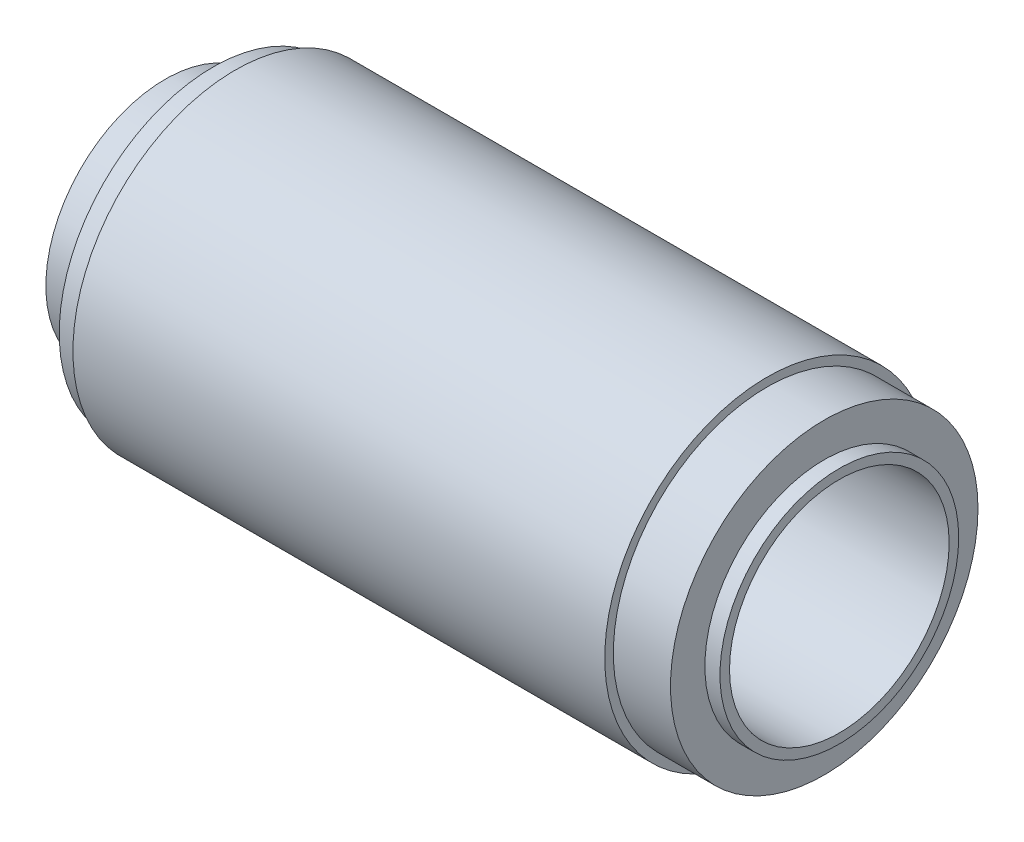
ISO-10303-21;
HEADER;
FILE_DESCRIPTION(('STEP AP214'),'2;1');
FILE_NAME('part.step','',(''),(''),'','','');
FILE_SCHEMA(('AUTOMOTIVE_DESIGN { 1 0 10303 214 1 1 1 1 }'));
ENDSEC;
DATA;
#1=APPLICATION_CONTEXT('core data for automotive mechanical design processes');
#2=APPLICATION_PROTOCOL_DEFINITION('international standard','automotive_design',2000,#1);
#3=PRODUCT_CONTEXT('',#1,'mechanical');
#4=PRODUCT('Part','Part','',(#3));
#5=PRODUCT_RELATED_PRODUCT_CATEGORY('part','',(#4));
#6=PRODUCT_DEFINITION_FORMATION('','',#4);
#7=PRODUCT_DEFINITION_CONTEXT('part definition',#1,'design');
#8=PRODUCT_DEFINITION('design','',#6,#7);
#9=PRODUCT_DEFINITION_SHAPE('','',#8);
#10=(LENGTH_UNIT() NAMED_UNIT(*) SI_UNIT(.MILLI.,.METRE.));
#11=(NAMED_UNIT(*) PLANE_ANGLE_UNIT() SI_UNIT($,.RADIAN.));
#12=(NAMED_UNIT(*) SI_UNIT($,.STERADIAN.) SOLID_ANGLE_UNIT());
#13=UNCERTAINTY_MEASURE_WITH_UNIT(LENGTH_MEASURE(1.E-05),#10,'distance_accuracy_value','');
#14=(GEOMETRIC_REPRESENTATION_CONTEXT(3) GLOBAL_UNCERTAINTY_ASSIGNED_CONTEXT((#13)) GLOBAL_UNIT_ASSIGNED_CONTEXT((#10,
#11,#12)) REPRESENTATION_CONTEXT('',''));
#15=CARTESIAN_POINT('',(0.,0.,0.));
#16=DIRECTION('',(0.,0.,1.));
#17=DIRECTION('',(1.,0.,0.));
#18=AXIS2_PLACEMENT_3D('',#15,#16,#17);
#19=CARTESIAN_POINT('',(0.,0.,0.));
#20=DIRECTION('',(1.,0.,0.));
#21=DIRECTION('',(0.,0.,-1.));
#22=AXIS2_PLACEMENT_3D('',#19,#20,#21);
#23=CYLINDRICAL_SURFACE('',#22,11.5);
#24=CARTESIAN_POINT('',(-101.19,0.,0.));
#25=DIRECTION('',(1.,0.,0.));
#26=DIRECTION('',(0.,0.,-1.));
#27=AXIS2_PLACEMENT_3D('',#24,#25,#26);
#28=CIRCLE('',#27,11.5);
#29=CARTESIAN_POINT('',(-101.19,0.,-11.5));
#30=VERTEX_POINT('',#29);
#31=EDGE_CURVE('E69',#30,#30,#28,.T.);
#32=ORIENTED_EDGE('',*,*,#31,.F.);
#33=EDGE_LOOP('',(#32));
#34=FACE_BOUND('',#33,.T.);
#35=CARTESIAN_POINT('',(-30.6,0.,0.));
#36=DIRECTION('',(1.,0.,0.));
#37=DIRECTION('',(0.,0.,-1.));
#38=AXIS2_PLACEMENT_3D('',#35,#36,#37);
#39=CIRCLE('',#38,11.5);
#40=CARTESIAN_POINT('',(-30.6,0.,-11.5));
#41=VERTEX_POINT('',#40);
#42=EDGE_CURVE('E10',#41,#41,#39,.T.);
#43=ORIENTED_EDGE('',*,*,#42,.T.);
#44=EDGE_LOOP('',(#43));
#45=FACE_BOUND('',#44,.T.);
#46=ADVANCED_FACE('F29',(#34,#45),#23,.F.);
#47=CARTESIAN_POINT('',(-30.6,0.,11.5));
#48=DIRECTION('',(-1.,0.,0.));
#49=DIRECTION('',(0.,0.,1.));
#50=AXIS2_PLACEMENT_3D('',#47,#48,#49);
#51=PLANE('',#50);
#52=ORIENTED_EDGE('',*,*,#42,.F.);
#53=EDGE_LOOP('',(#52));
#54=FACE_BOUND('',#53,.T.);
#55=CARTESIAN_POINT('',(-30.6,0.,0.));
#56=DIRECTION('',(1.,0.,0.));
#57=DIRECTION('',(0.,0.,-1.));
#58=AXIS2_PLACEMENT_3D('',#55,#56,#57);
#59=CIRCLE('',#58,12.5);
#60=CARTESIAN_POINT('',(-30.6,0.,-12.5));
#61=VERTEX_POINT('',#60);
#62=EDGE_CURVE('E35',#61,#61,#59,.T.);
#63=ORIENTED_EDGE('',*,*,#62,.T.);
#64=EDGE_LOOP('',(#63));
#65=FACE_BOUND('',#64,.T.);
#66=ADVANCED_FACE('F76',(#54,#65),#51,.F.);
#67=CARTESIAN_POINT('',(0.,0.,0.));
#68=DIRECTION('',(1.,0.,0.));
#69=DIRECTION('',(0.,0.,-1.));
#70=AXIS2_PLACEMENT_3D('',#67,#68,#69);
#71=CYLINDRICAL_SURFACE('',#70,12.5);
#72=ORIENTED_EDGE('',*,*,#62,.F.);
#73=EDGE_LOOP('',(#72));
#74=FACE_BOUND('',#73,.T.);
#75=CARTESIAN_POINT('',(-32.18,0.,0.));
#76=DIRECTION('',(1.,0.,0.));
#77=DIRECTION('',(0.,0.,-1.));
#78=AXIS2_PLACEMENT_3D('',#75,#76,#77);
#79=CIRCLE('',#78,12.5);
#80=CARTESIAN_POINT('',(-32.18,0.,-12.5));
#81=VERTEX_POINT('',#80);
#82=EDGE_CURVE('E39',#81,#81,#79,.T.);
#83=ORIENTED_EDGE('',*,*,#82,.T.);
#84=EDGE_LOOP('',(#83));
#85=FACE_BOUND('',#84,.T.);
#86=ADVANCED_FACE('F80',(#74,#85),#71,.T.);
#87=CARTESIAN_POINT('',(-32.18,0.,12.5));
#88=DIRECTION('',(-1.,0.,0.));
#89=DIRECTION('',(0.,0.,1.));
#90=AXIS2_PLACEMENT_3D('',#87,#88,#89);
#91=PLANE('',#90);
#92=ORIENTED_EDGE('',*,*,#82,.F.);
#93=EDGE_LOOP('',(#92));
#94=FACE_BOUND('',#93,.T.);
#95=CARTESIAN_POINT('',(-32.18,0.,0.));
#96=DIRECTION('',(1.,0.,0.));
#97=DIRECTION('',(0.,0.,-1.));
#98=AXIS2_PLACEMENT_3D('',#95,#96,#97);
#99=CIRCLE('',#98,16.1);
#100=CARTESIAN_POINT('',(-32.18,0.,-16.1));
#101=VERTEX_POINT('',#100);
#102=EDGE_CURVE('E43',#101,#101,#99,.T.);
#103=ORIENTED_EDGE('',*,*,#102,.T.);
#104=EDGE_LOOP('',(#103));
#105=FACE_BOUND('',#104,.T.);
#106=ADVANCED_FACE('F85',(#94,#105),#91,.F.);
#107=CARTESIAN_POINT('',(0.,0.,0.));
#108=DIRECTION('',(1.,0.,0.));
#109=DIRECTION('',(0.,0.,-1.));
#110=AXIS2_PLACEMENT_3D('',#107,#108,#109);
#111=CYLINDRICAL_SURFACE('',#110,16.1);
#112=ORIENTED_EDGE('',*,*,#102,.F.);
#113=EDGE_LOOP('',(#112));
#114=FACE_BOUND('',#113,.T.);
#115=CARTESIAN_POINT('',(-38.1653578558547,0.,0.));
#116=DIRECTION('',(1.,0.,0.));
#117=DIRECTION('',(0.,0.,-1.));
#118=AXIS2_PLACEMENT_3D('',#115,#116,#117);
#119=CIRCLE('',#118,16.1);
#120=CARTESIAN_POINT('',(-38.1653578558547,0.,-16.1));
#121=VERTEX_POINT('',#120);
#122=EDGE_CURVE('E48',#121,#121,#119,.T.);
#123=ORIENTED_EDGE('',*,*,#122,.T.);
#124=EDGE_LOOP('',(#123));
#125=FACE_BOUND('',#124,.T.);
#126=ADVANCED_FACE('F91',(#114,#125),#111,.T.);
#127=CARTESIAN_POINT('',(-38.1653578558547,0.,16.1));
#128=DIRECTION('',(-1.,0.,0.));
#129=DIRECTION('',(0.,0.,1.));
#130=AXIS2_PLACEMENT_3D('',#127,#128,#129);
#131=PLANE('',#130);
#132=ORIENTED_EDGE('',*,*,#122,.F.);
#133=EDGE_LOOP('',(#132));
#134=FACE_BOUND('',#133,.T.);
#135=CARTESIAN_POINT('',(-38.1653578558547,0.,0.));
#136=DIRECTION('',(1.,0.,0.));
#137=DIRECTION('',(0.,0.,-1.));
#138=AXIS2_PLACEMENT_3D('',#135,#136,#137);
#139=CIRCLE('',#138,17.);
#140=CARTESIAN_POINT('',(-38.1653578558547,0.,-17.));
#141=VERTEX_POINT('',#140);
#142=EDGE_CURVE('E51',#141,#141,#139,.T.);
#143=ORIENTED_EDGE('',*,*,#142,.T.);
#144=EDGE_LOOP('',(#143));
#145=FACE_BOUND('',#144,.T.);
#146=ADVANCED_FACE('F95',(#134,#145),#131,.F.);
#147=CARTESIAN_POINT('',(0.,0.,0.));
#148=DIRECTION('',(1.,0.,0.));
#149=DIRECTION('',(0.,0.,-1.));
#150=AXIS2_PLACEMENT_3D('',#147,#148,#149);
#151=CYLINDRICAL_SURFACE('',#150,17.);
#152=ORIENTED_EDGE('',*,*,#142,.F.);
#153=EDGE_LOOP('',(#152));
#154=FACE_BOUND('',#153,.T.);
#155=CARTESIAN_POINT('',(-93.8536878680401,0.,0.));
#156=DIRECTION('',(1.,0.,0.));
#157=DIRECTION('',(0.,0.,-1.));
#158=AXIS2_PLACEMENT_3D('',#155,#156,#157);
#159=CIRCLE('',#158,17.);
#160=CARTESIAN_POINT('',(-93.8536878680401,0.,-17.));
#161=VERTEX_POINT('',#160);
#162=EDGE_CURVE('E54',#161,#161,#159,.T.);
#163=ORIENTED_EDGE('',*,*,#162,.T.);
#164=EDGE_LOOP('',(#163));
#165=FACE_BOUND('',#164,.T.);
#166=ADVANCED_FACE('F99',(#154,#165),#151,.T.);
#167=CARTESIAN_POINT('',(-93.8536878680401,0.,17.));
#168=DIRECTION('',(1.,0.,0.));
#169=DIRECTION('',(0.,0.,-1.));
#170=AXIS2_PLACEMENT_3D('',#167,#168,#169);
#171=PLANE('',#170);
#172=ORIENTED_EDGE('',*,*,#162,.F.);
#173=EDGE_LOOP('',(#172));
#174=FACE_BOUND('',#173,.T.);
#175=CARTESIAN_POINT('',(-93.8536878680401,0.,0.));
#176=DIRECTION('',(1.,0.,0.));
#177=DIRECTION('',(0.,0.,-1.));
#178=AXIS2_PLACEMENT_3D('',#175,#176,#177);
#179=CIRCLE('',#178,16.1);
#180=CARTESIAN_POINT('',(-93.8536878680401,0.,-16.1));
#181=VERTEX_POINT('',#180);
#182=EDGE_CURVE('E57',#181,#181,#179,.T.);
#183=ORIENTED_EDGE('',*,*,#182,.T.);
#184=EDGE_LOOP('',(#183));
#185=FACE_BOUND('',#184,.T.);
#186=ADVANCED_FACE('F103',(#174,#185),#171,.F.);
#187=CARTESIAN_POINT('',(0.,0.,0.));
#188=DIRECTION('',(1.,0.,0.));
#189=DIRECTION('',(0.,0.,-1.));
#190=AXIS2_PLACEMENT_3D('',#187,#188,#189);
#191=CYLINDRICAL_SURFACE('',#190,16.1);
#192=ORIENTED_EDGE('',*,*,#182,.F.);
#193=EDGE_LOOP('',(#192));
#194=FACE_BOUND('',#193,.T.);
#195=CARTESIAN_POINT('',(-96.19,0.,0.));
#196=DIRECTION('',(1.,0.,0.));
#197=DIRECTION('',(0.,0.,-1.));
#198=AXIS2_PLACEMENT_3D('',#195,#196,#197);
#199=CIRCLE('',#198,16.1);
#200=CARTESIAN_POINT('',(-96.19,0.,-16.1));
#201=VERTEX_POINT('',#200);
#202=EDGE_CURVE('E60',#201,#201,#199,.T.);
#203=ORIENTED_EDGE('',*,*,#202,.T.);
#204=EDGE_LOOP('',(#203));
#205=FACE_BOUND('',#204,.T.);
#206=ADVANCED_FACE('F107',(#194,#205),#191,.T.);
#207=CARTESIAN_POINT('',(-96.19,0.,16.1));
#208=DIRECTION('',(1.,0.,0.));
#209=DIRECTION('',(0.,0.,-1.));
#210=AXIS2_PLACEMENT_3D('',#207,#208,#209);
#211=PLANE('',#210);
#212=ORIENTED_EDGE('',*,*,#202,.F.);
#213=EDGE_LOOP('',(#212));
#214=FACE_BOUND('',#213,.T.);
#215=CARTESIAN_POINT('',(-96.19,0.,0.));
#216=DIRECTION('',(1.,0.,0.));
#217=DIRECTION('',(0.,0.,-1.));
#218=AXIS2_PLACEMENT_3D('',#215,#216,#217);
#219=CIRCLE('',#218,12.5);
#220=CARTESIAN_POINT('',(-96.19,0.,-12.5));
#221=VERTEX_POINT('',#220);
#222=EDGE_CURVE('E63',#221,#221,#219,.T.);
#223=ORIENTED_EDGE('',*,*,#222,.T.);
#224=EDGE_LOOP('',(#223));
#225=FACE_BOUND('',#224,.T.);
#226=ADVANCED_FACE('F111',(#214,#225),#211,.F.);
#227=CARTESIAN_POINT('',(0.,0.,0.));
#228=DIRECTION('',(1.,0.,0.));
#229=DIRECTION('',(0.,0.,-1.));
#230=AXIS2_PLACEMENT_3D('',#227,#228,#229);
#231=CYLINDRICAL_SURFACE('',#230,12.5);
#232=ORIENTED_EDGE('',*,*,#222,.F.);
#233=EDGE_LOOP('',(#232));
#234=FACE_BOUND('',#233,.T.);
#235=CARTESIAN_POINT('',(-101.19,0.,0.));
#236=DIRECTION('',(1.,0.,0.));
#237=DIRECTION('',(0.,0.,-1.));
#238=AXIS2_PLACEMENT_3D('',#235,#236,#237);
#239=CIRCLE('',#238,12.5);
#240=CARTESIAN_POINT('',(-101.19,0.,-12.5));
#241=VERTEX_POINT('',#240);
#242=EDGE_CURVE('E66',#241,#241,#239,.T.);
#243=ORIENTED_EDGE('',*,*,#242,.T.);
#244=EDGE_LOOP('',(#243));
#245=FACE_BOUND('',#244,.T.);
#246=ADVANCED_FACE('F115',(#234,#245),#231,.T.);
#247=CARTESIAN_POINT('',(-101.19,0.,12.5));
#248=DIRECTION('',(1.,0.,0.));
#249=DIRECTION('',(0.,0.,-1.));
#250=AXIS2_PLACEMENT_3D('',#247,#248,#249);
#251=PLANE('',#250);
#252=ORIENTED_EDGE('',*,*,#242,.F.);
#253=EDGE_LOOP('',(#252));
#254=FACE_BOUND('',#253,.T.);
#255=ORIENTED_EDGE('',*,*,#31,.T.);
#256=EDGE_LOOP('',(#255));
#257=FACE_BOUND('',#256,.T.);
#258=ADVANCED_FACE('F73',(#254,#257),#251,.F.);
#259=CLOSED_SHELL('',(#46,#66,#86,#106,#126,#146,#166,#186,#206,#226,#246,#258));
#260=MANIFOLD_SOLID_BREP('B2',#259);
#261=ADVANCED_BREP_SHAPE_REPRESENTATION('',(#18,#260),#14);
#262=SHAPE_DEFINITION_REPRESENTATION(#9,#261);
ENDSEC;
END-ISO-10303-21;
